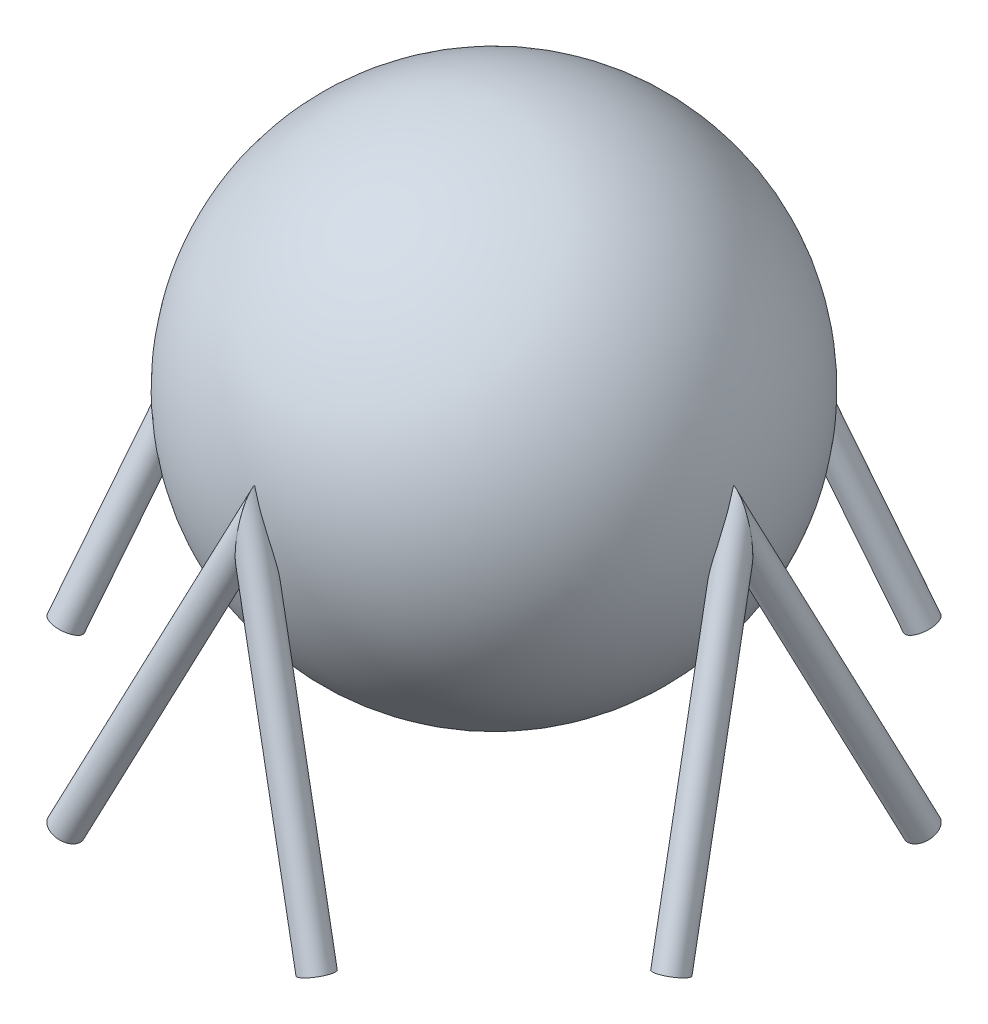
ISO-10303-21;
HEADER;
FILE_DESCRIPTION(('STEP AP214'),'2;1');
FILE_NAME('part.step','',(''),(''),'','','');
FILE_SCHEMA(('AUTOMOTIVE_DESIGN { 1 0 10303 214 1 1 1 1 }'));
ENDSEC;
DATA;
#1=APPLICATION_CONTEXT('core data for automotive mechanical design processes');
#2=APPLICATION_PROTOCOL_DEFINITION('international standard','automotive_design',2000,#1);
#3=PRODUCT_CONTEXT('',#1,'mechanical');
#4=PRODUCT('Part','Part','',(#3));
#5=PRODUCT_RELATED_PRODUCT_CATEGORY('part','',(#4));
#6=PRODUCT_DEFINITION_FORMATION('','',#4);
#7=PRODUCT_DEFINITION_CONTEXT('part definition',#1,'design');
#8=PRODUCT_DEFINITION('design','',#6,#7);
#9=PRODUCT_DEFINITION_SHAPE('','',#8);
#10=(LENGTH_UNIT() NAMED_UNIT(*) SI_UNIT(.MILLI.,.METRE.));
#11=(NAMED_UNIT(*) PLANE_ANGLE_UNIT() SI_UNIT($,.RADIAN.));
#12=(NAMED_UNIT(*) SI_UNIT($,.STERADIAN.) SOLID_ANGLE_UNIT());
#13=UNCERTAINTY_MEASURE_WITH_UNIT(LENGTH_MEASURE(1.E-05),#10,'distance_accuracy_value','');
#14=(GEOMETRIC_REPRESENTATION_CONTEXT(3) GLOBAL_UNCERTAINTY_ASSIGNED_CONTEXT((#13)) GLOBAL_UNIT_ASSIGNED_CONTEXT((#10,
#11,#12)) REPRESENTATION_CONTEXT('',''));
#15=CARTESIAN_POINT('',(0.,0.,0.));
#16=DIRECTION('',(0.,0.,1.));
#17=DIRECTION('',(1.,0.,0.));
#18=AXIS2_PLACEMENT_3D('',#15,#16,#17);
#19=CARTESIAN_POINT('',(274.31238,0.,-1.2490009027033E-13));
#20=DIRECTION('',(0.186456443584801,-0.902667771423086,0.387846476172967));
#21=DIRECTION('',(0.,-0.394769458097228,-0.918780210362426));
#22=AXIS2_PLACEMENT_3D('',#19,#20,#21);
#23=CYLINDRICAL_SURFACE('',#22,13.3223);
#24=CARTESIAN_POINT('',(342.519,-330.2,141.876015170467));
#25=DIRECTION('',(-0.186456443584801,0.902667771423086,-0.387846476172967));
#26=DIRECTION('',(0.,0.394769458097228,0.918780210362427));
#27=AXIS2_PLACEMENT_3D('',#24,#25,#26);
#28=CIRCLE('',#27,13.3223);
#29=CARTESIAN_POINT('',(342.519,-324.940762848391,154.116280766978));
#30=VERTEX_POINT('',#29);
#31=EDGE_CURVE('E61',#30,#30,#28,.T.);
#32=ORIENTED_EDGE('',*,*,#31,.F.);
#33=EDGE_LOOP('',(#32));
#34=FACE_BOUND('',#33,.T.);
#35=CARTESIAN_POINT('',(274.31238,0.,-1.2490009027033E-13));
#36=DIRECTION('',(0.,0.,-1.));
#37=DIRECTION('',(0.202290974214957,-0.979325462627805,0.));
#38=AXIS2_PLACEMENT_3D('',#35,#36,#37);
#39=ELLIPSE('',#38,34.3494161180897,13.3223);
#40=CARTESIAN_POINT('',(281.260956850243,-33.6392578308431,-1.38247519700187E-13));
#41=VERTEX_POINT('',#40);
#42=EDGE_CURVE('E57',#41,#41,#39,.T.);
#43=ORIENTED_EDGE('',*,*,#42,.T.);
#44=EDGE_LOOP('',(#43));
#45=FACE_BOUND('',#44,.T.);
#46=ADVANCED_FACE('F53',(#34,#45),#23,.F.);
#47=CARTESIAN_POINT('',(274.31238,0.,-1.2490009027033E-13));
#48=DIRECTION('',(0.186456443584801,-0.902667771423086,0.387846476172967));
#49=DIRECTION('',(0.,-0.394769458097228,-0.918780210362426));
#50=AXIS2_PLACEMENT_3D('',#47,#48,#49);
#51=CYLINDRICAL_SURFACE('',#50,16.7005);
#52=CARTESIAN_POINT('',(342.519,-330.2,141.876015170467));
#53=DIRECTION('',(-0.186456443584801,0.902667771423086,-0.387846476172967));
#54=DIRECTION('',(0.,0.394769458097228,0.918780210362427));
#55=AXIS2_PLACEMENT_3D('',#52,#53,#54);
#56=CIRCLE('',#55,16.7005);
#57=CARTESIAN_POINT('',(342.519,-323.607152665047,157.220104073625));
#58=VERTEX_POINT('',#57);
#59=EDGE_CURVE('E65',#58,#58,#56,.T.);
#60=ORIENTED_EDGE('',*,*,#59,.T.);
#61=EDGE_LOOP('',(#60));
#62=FACE_BOUND('',#61,.T.);
#63=CARTESIAN_POINT('',(274.31238,0.,-1.2490009027033E-13));
#64=DIRECTION('',(0.,0.,-1.));
#65=DIRECTION('',(0.202290974214957,-0.979325462627805,0.));
#66=AXIS2_PLACEMENT_3D('',#63,#64,#65);
#67=ELLIPSE('',#66,43.0595635798741,16.7005);
#68=CARTESIAN_POINT('',(283.022941065844,-42.1693270234116,-1.41632091891171E-13));
#69=VERTEX_POINT('',#68);
#70=EDGE_CURVE('E12',#69,#69,#67,.T.);
#71=ORIENTED_EDGE('',*,*,#70,.F.);
#72=EDGE_LOOP('',(#71));
#73=FACE_BOUND('',#72,.T.);
#74=ADVANCED_FACE('F80',(#62,#73),#51,.T.);
#75=CARTESIAN_POINT('',(342.519,-330.2,141.876015170467));
#76=DIRECTION('',(-0.186456443584801,0.902667771423086,-0.387846476172967));
#77=DIRECTION('',(0.,0.394769458097228,0.918780210362427));
#78=AXIS2_PLACEMENT_3D('',#75,#76,#77);
#79=PLANE('',#78);
#80=ORIENTED_EDGE('',*,*,#31,.T.);
#81=EDGE_LOOP('',(#80));
#82=FACE_BOUND('',#81,.T.);
#83=ORIENTED_EDGE('',*,*,#59,.F.);
#84=EDGE_LOOP('',(#83));
#85=FACE_BOUND('',#84,.T.);
#86=ADVANCED_FACE('F76',(#82,#85),#79,.F.);
#87=CARTESIAN_POINT('',(274.31238,0.,-1.2490009027033E-13));
#88=DIRECTION('',(0.,0.,-1.));
#89=DIRECTION('',(-0.999999999999999,0.,0.));
#90=AXIS2_PLACEMENT_3D('',#87,#88,#89);
#91=PLANE('',#90);
#92=ORIENTED_EDGE('',*,*,#42,.F.);
#93=EDGE_LOOP('',(#92));
#94=FACE_BOUND('',#93,.T.);
#95=ORIENTED_EDGE('',*,*,#70,.T.);
#96=EDGE_LOOP('',(#95));
#97=FACE_BOUND('',#96,.T.);
#98=ADVANCED_FACE('F55',(#94,#97),#91,.T.);
#99=CLOSED_SHELL('',(#46,#74,#86,#98));
#100=MANIFOLD_SOLID_BREP('B2_NOT_SHOWN',#99);
#101=CARTESIAN_POINT('',(342.519,-330.2,-141.876015170467));
#102=DIRECTION('',(-0.186456443584801,0.902667771423086,0.387846476172966));
#103=DIRECTION('',(0.,-0.394769458097227,0.918780210362425));
#104=AXIS2_PLACEMENT_3D('',#101,#102,#103);
#105=CYLINDRICAL_SURFACE('',#104,13.3223);
#106=CARTESIAN_POINT('',(342.519,-330.2,-141.876015170467));
#107=DIRECTION('',(0.186456443584801,-0.902667771423086,-0.387846476172967));
#108=DIRECTION('',(0.,0.394769458097227,-0.918780210362425));
#109=AXIS2_PLACEMENT_3D('',#106,#107,#108);
#110=CIRCLE('',#109,13.3223);
#111=CARTESIAN_POINT('',(342.519,-324.940762848391,-154.116280766979));
#112=VERTEX_POINT('',#111);
#113=EDGE_CURVE('E162',#112,#112,#110,.T.);
#114=ORIENTED_EDGE('',*,*,#113,.T.);
#115=EDGE_LOOP('',(#114));
#116=FACE_BOUND('',#115,.T.);
#117=CARTESIAN_POINT('',(274.31238,0.,-1.11022302462516E-13));
#118=DIRECTION('',(0.,0.,1.));
#119=DIRECTION('',(-0.202290974214957,0.979325462627805,0.));
#120=AXIS2_PLACEMENT_3D('',#117,#118,#119);
#121=ELLIPSE('',#120,34.3494161180897,13.3223);
#122=CARTESIAN_POINT('',(267.363803149757,33.6392578308431,-1.14835853728189E-13));
#123=VERTEX_POINT('',#122);
#124=EDGE_CURVE('E152',#123,#123,#121,.T.);
#125=ORIENTED_EDGE('',*,*,#124,.T.);
#126=EDGE_LOOP('',(#125));
#127=FACE_BOUND('',#126,.T.);
#128=ADVANCED_FACE('F148',(#116,#127),#105,.F.);
#129=CARTESIAN_POINT('',(342.519,-330.2,-141.876015170467));
#130=DIRECTION('',(-0.186456443584801,0.902667771423086,0.387846476172966));
#131=DIRECTION('',(0.,-0.394769458097227,0.918780210362425));
#132=AXIS2_PLACEMENT_3D('',#129,#130,#131);
#133=CYLINDRICAL_SURFACE('',#132,16.7005);
#134=CARTESIAN_POINT('',(342.519,-330.2,-141.876015170467));
#135=DIRECTION('',(0.186456443584801,-0.902667771423086,-0.387846476172967));
#136=DIRECTION('',(0.,0.394769458097227,-0.918780210362425));
#137=AXIS2_PLACEMENT_3D('',#134,#135,#136);
#138=CIRCLE('',#137,16.7005);
#139=CARTESIAN_POINT('',(342.519,-323.607152665047,-157.220104073625));
#140=VERTEX_POINT('',#139);
#141=EDGE_CURVE('E156',#140,#140,#138,.T.);
#142=ORIENTED_EDGE('',*,*,#141,.F.);
#143=EDGE_LOOP('',(#142));
#144=FACE_BOUND('',#143,.T.);
#145=CARTESIAN_POINT('',(274.31238,0.,-1.11022302462516E-13));
#146=DIRECTION('',(0.,0.,1.));
#147=DIRECTION('',(-0.202290974214957,0.979325462627805,0.));
#148=AXIS2_PLACEMENT_3D('',#145,#146,#147);
#149=ELLIPSE('',#148,43.0595635798742,16.7005);
#150=CARTESIAN_POINT('',(265.601818934157,42.1693270234116,-1.15802874354184E-13));
#151=VERTEX_POINT('',#150);
#152=EDGE_CURVE('E52',#151,#151,#149,.T.);
#153=ORIENTED_EDGE('',*,*,#152,.F.);
#154=EDGE_LOOP('',(#153));
#155=FACE_BOUND('',#154,.T.);
#156=ADVANCED_FACE('F175',(#144,#155),#133,.T.);
#157=CARTESIAN_POINT('',(342.519,-330.2,-141.876015170467));
#158=DIRECTION('',(0.186456443584801,-0.902667771423086,-0.387846476172967));
#159=DIRECTION('',(0.,0.394769458097227,-0.918780210362425));
#160=AXIS2_PLACEMENT_3D('',#157,#158,#159);
#161=PLANE('',#160);
#162=ORIENTED_EDGE('',*,*,#113,.F.);
#163=EDGE_LOOP('',(#162));
#164=FACE_BOUND('',#163,.T.);
#165=ORIENTED_EDGE('',*,*,#141,.T.);
#166=EDGE_LOOP('',(#165));
#167=FACE_BOUND('',#166,.T.);
#168=ADVANCED_FACE('F171',(#164,#167),#161,.T.);
#169=CARTESIAN_POINT('',(274.31238,0.,-1.2490009027033E-13));
#170=DIRECTION('',(0.,0.,1.));
#171=DIRECTION('',(1.,0.,0.));
#172=AXIS2_PLACEMENT_3D('',#169,#170,#171);
#173=PLANE('',#172);
#174=ORIENTED_EDGE('',*,*,#124,.F.);
#175=EDGE_LOOP('',(#174));
#176=FACE_BOUND('',#175,.T.);
#177=ORIENTED_EDGE('',*,*,#152,.T.);
#178=EDGE_LOOP('',(#177));
#179=FACE_BOUND('',#178,.T.);
#180=ADVANCED_FACE('F150',(#176,#179),#173,.T.);
#181=CLOSED_SHELL('',(#128,#156,#168,#180));
#182=MANIFOLD_SOLID_BREP('B7_NOT_SHOWN',#181);
#183=CARTESIAN_POINT('',(-1.06858966120171E-12,1.11022302462516E-13,274.31238));
#184=DIRECTION('',(-0.387846476172967,-0.902667771423086,0.1864564435848));
#185=DIRECTION('',(0.918780210362425,-0.394769458097228,0.));
#186=AXIS2_PLACEMENT_3D('',#183,#184,#185);
#187=CYLINDRICAL_SURFACE('',#186,13.3223);
#188=CARTESIAN_POINT('',(-141.876015170468,-330.2,342.519));
#189=DIRECTION('',(0.387846476172967,0.902667771423086,-0.1864564435848));
#190=DIRECTION('',(0.0389159408015235,-0.218147238009058,-0.975139647486734));
#191=AXIS2_PLACEMENT_3D('',#188,#189,#190);
#192=CIRCLE('',#191,13.3223);
#193=CARTESIAN_POINT('',(-141.357565332328,-333.106222948928,329.527897074287));
#194=VERTEX_POINT('',#193);
#195=EDGE_CURVE('E251',#194,#194,#192,.T.);
#196=ORIENTED_EDGE('',*,*,#195,.F.);
#197=EDGE_LOOP('',(#196));
#198=FACE_BOUND('',#197,.T.);
#199=CARTESIAN_POINT('',(-1.08246744900953E-12,0.,274.31238));
#200=DIRECTION('',(1.,0.,0.));
#201=DIRECTION('',(0.,-0.979325462627805,0.202290974214957));
#202=AXIS2_PLACEMENT_3D('',#199,#200,#201);
#203=ELLIPSE('',#202,34.3494161180897,13.3223);
#204=CARTESIAN_POINT('',(-1.09581487843938E-12,-33.6392578308431,281.260956850243));
#205=VERTEX_POINT('',#204);
#206=EDGE_CURVE('E247',#205,#205,#203,.T.);
#207=ORIENTED_EDGE('',*,*,#206,.T.);
#208=EDGE_LOOP('',(#207));
#209=FACE_BOUND('',#208,.T.);
#210=ADVANCED_FACE('F243',(#198,#209),#187,.F.);
#211=CARTESIAN_POINT('',(-1.06858966120171E-12,1.11022302462516E-13,274.31238));
#212=DIRECTION('',(-0.387846476172967,-0.902667771423086,0.1864564435848));
#213=DIRECTION('',(0.918780210362425,-0.394769458097228,0.));
#214=AXIS2_PLACEMENT_3D('',#211,#212,#213);
#215=CYLINDRICAL_SURFACE('',#214,16.7005);
#216=CARTESIAN_POINT('',(-141.876015170468,-330.2,342.519));
#217=DIRECTION('',(0.387846476172967,0.902667771423086,-0.1864564435848));
#218=DIRECTION('',(0.0389159408015235,-0.218147238009058,-0.975139647486734));
#219=AXIS2_PLACEMENT_3D('',#216,#217,#218);
#220=CIRCLE('',#219,16.7005);
#221=CARTESIAN_POINT('',(-141.226099501113,-333.84316794837,326.233680317148));
#222=VERTEX_POINT('',#221);
#223=EDGE_CURVE('E255',#222,#222,#220,.T.);
#224=ORIENTED_EDGE('',*,*,#223,.T.);
#225=EDGE_LOOP('',(#224));
#226=FACE_BOUND('',#225,.T.);
#227=CARTESIAN_POINT('',(-1.08246744900953E-12,0.,274.31238));
#228=DIRECTION('',(1.,0.,0.));
#229=DIRECTION('',(0.,-0.979325462627805,0.202290974214957));
#230=AXIS2_PLACEMENT_3D('',#227,#228,#229);
#231=ELLIPSE('',#230,43.0595635798742,16.7005);
#232=CARTESIAN_POINT('',(-1.09919945063037E-12,-42.1693270234116,283.022941065844));
#233=VERTEX_POINT('',#232);
#234=EDGE_CURVE('E147',#233,#233,#231,.T.);
#235=ORIENTED_EDGE('',*,*,#234,.F.);
#236=EDGE_LOOP('',(#235));
#237=FACE_BOUND('',#236,.T.);
#238=ADVANCED_FACE('F270',(#226,#237),#215,.T.);
#239=CARTESIAN_POINT('',(-141.876015170468,-330.2,342.519));
#240=DIRECTION('',(0.387846476172967,0.902667771423086,-0.1864564435848));
#241=DIRECTION('',(0.0389159408015235,-0.218147238009058,-0.975139647486734));
#242=AXIS2_PLACEMENT_3D('',#239,#240,#241);
#243=PLANE('',#242);
#244=ORIENTED_EDGE('',*,*,#195,.T.);
#245=EDGE_LOOP('',(#244));
#246=FACE_BOUND('',#245,.T.);
#247=ORIENTED_EDGE('',*,*,#223,.F.);
#248=EDGE_LOOP('',(#247));
#249=FACE_BOUND('',#248,.T.);
#250=ADVANCED_FACE('F266',(#246,#249),#243,.F.);
#251=CARTESIAN_POINT('',(-1.08246744900953E-12,0.,274.31238));
#252=DIRECTION('',(1.,0.,0.));
#253=DIRECTION('',(0.,0.,-1.));
#254=AXIS2_PLACEMENT_3D('',#251,#252,#253);
#255=PLANE('',#254);
#256=ORIENTED_EDGE('',*,*,#206,.F.);
#257=EDGE_LOOP('',(#256));
#258=FACE_BOUND('',#257,.T.);
#259=ORIENTED_EDGE('',*,*,#234,.T.);
#260=EDGE_LOOP('',(#259));
#261=FACE_BOUND('',#260,.T.);
#262=ADVANCED_FACE('F245',(#258,#261),#255,.T.);
#263=CLOSED_SHELL('',(#210,#238,#250,#262));
#264=MANIFOLD_SOLID_BREP('B47_NOT_SHOWN',#263);
#265=CARTESIAN_POINT('',(141.876015170466,-330.2,342.519000000001));
#266=DIRECTION('',(-0.387846476172966,0.902667771423086,-0.186456443584802));
#267=DIRECTION('',(-0.918780210362425,-0.394769458097227,0.));
#268=AXIS2_PLACEMENT_3D('',#265,#266,#267);
#269=CYLINDRICAL_SURFACE('',#268,13.3223);
#270=CARTESIAN_POINT('',(141.876015170466,-330.2,342.519000000001));
#271=DIRECTION('',(0.387846476172967,-0.902667771423086,0.186456443584802));
#272=DIRECTION('',(-0.0389159408015174,-0.218147238009058,-0.975139647486734));
#273=AXIS2_PLACEMENT_3D('',#270,#271,#272);
#274=CIRCLE('',#273,13.3223);
#275=CARTESIAN_POINT('',(141.357565332326,-333.106222948928,329.527897074288));
#276=VERTEX_POINT('',#275);
#277=EDGE_CURVE('E352',#276,#276,#274,.T.);
#278=ORIENTED_EDGE('',*,*,#277,.T.);
#279=EDGE_LOOP('',(#278));
#280=FACE_BOUND('',#279,.T.);
#281=CARTESIAN_POINT('',(-1.13797860024079E-12,1.94289029309402E-13,274.31238));
#282=DIRECTION('',(-1.,0.,0.));
#283=DIRECTION('',(0.,0.979325462627805,-0.202290974214957));
#284=AXIS2_PLACEMENT_3D('',#281,#282,#283);
#285=ELLIPSE('',#284,34.3494161180897,13.3223);
#286=CARTESIAN_POINT('',(-1.12081761954526E-12,33.6392578308433,267.363803149757));
#287=VERTEX_POINT('',#286);
#288=EDGE_CURVE('E342',#287,#287,#285,.T.);
#289=ORIENTED_EDGE('',*,*,#288,.T.);
#290=EDGE_LOOP('',(#289));
#291=FACE_BOUND('',#290,.T.);
#292=ADVANCED_FACE('F338',(#280,#291),#269,.F.);
#293=CARTESIAN_POINT('',(141.876015170466,-330.2,342.519000000001));
#294=DIRECTION('',(-0.387846476172966,0.902667771423086,-0.186456443584802));
#295=DIRECTION('',(-0.918780210362425,-0.394769458097227,0.));
#296=AXIS2_PLACEMENT_3D('',#293,#294,#295);
#297=CYLINDRICAL_SURFACE('',#296,16.7005);
#298=CARTESIAN_POINT('',(141.876015170466,-330.2,342.519000000001));
#299=DIRECTION('',(0.387846476172967,-0.902667771423086,0.186456443584802));
#300=DIRECTION('',(-0.0389159408015174,-0.218147238009058,-0.975139647486734));
#301=AXIS2_PLACEMENT_3D('',#298,#299,#300);
#302=CIRCLE('',#301,16.7005);
#303=CARTESIAN_POINT('',(141.22609950111,-333.84316794837,326.233680317148));
#304=VERTEX_POINT('',#303);
#305=EDGE_CURVE('E346',#304,#304,#302,.T.);
#306=ORIENTED_EDGE('',*,*,#305,.F.);
#307=EDGE_LOOP('',(#306));
#308=FACE_BOUND('',#307,.T.);
#309=CARTESIAN_POINT('',(-1.13797860024079E-12,1.94289029309402E-13,274.31238));
#310=DIRECTION('',(-1.,0.,0.));
#311=DIRECTION('',(0.,0.979325462627805,-0.202290974214957));
#312=AXIS2_PLACEMENT_3D('',#309,#310,#311);
#313=ELLIPSE('',#312,43.0595635798742,16.7005);
#314=CARTESIAN_POINT('',(-1.11646602672828E-12,42.1693270234118,265.601818934157));
#315=VERTEX_POINT('',#314);
#316=EDGE_CURVE('E242',#315,#315,#313,.T.);
#317=ORIENTED_EDGE('',*,*,#316,.F.);
#318=EDGE_LOOP('',(#317));
#319=FACE_BOUND('',#318,.T.);
#320=ADVANCED_FACE('F365',(#308,#319),#297,.T.);
#321=CARTESIAN_POINT('',(141.876015170466,-330.2,342.519000000001));
#322=DIRECTION('',(0.387846476172967,-0.902667771423086,0.186456443584802));
#323=DIRECTION('',(-0.0389159408015174,-0.218147238009058,-0.975139647486734));
#324=AXIS2_PLACEMENT_3D('',#321,#322,#323);
#325=PLANE('',#324);
#326=ORIENTED_EDGE('',*,*,#277,.F.);
#327=EDGE_LOOP('',(#326));
#328=FACE_BOUND('',#327,.T.);
#329=ORIENTED_EDGE('',*,*,#305,.T.);
#330=EDGE_LOOP('',(#329));
#331=FACE_BOUND('',#330,.T.);
#332=ADVANCED_FACE('F361',(#328,#331),#325,.T.);
#333=CARTESIAN_POINT('',(-1.1518563880486E-12,0.,274.31238));
#334=DIRECTION('',(-1.,0.,0.));
#335=DIRECTION('',(0.,0.,1.));
#336=AXIS2_PLACEMENT_3D('',#333,#334,#335);
#337=PLANE('',#336);
#338=ORIENTED_EDGE('',*,*,#288,.F.);
#339=EDGE_LOOP('',(#338));
#340=FACE_BOUND('',#339,.T.);
#341=ORIENTED_EDGE('',*,*,#316,.T.);
#342=EDGE_LOOP('',(#341));
#343=FACE_BOUND('',#342,.T.);
#344=ADVANCED_FACE('F340',(#340,#343),#337,.T.);
#345=CLOSED_SHELL('',(#292,#320,#332,#344));
#346=MANIFOLD_SOLID_BREP('B142_NOT_SHOWN',#345);
#347=CARTESIAN_POINT('',(-274.31238,0.,0.));
#348=DIRECTION('',(-0.186456443584801,-0.902667771423086,-0.387846476172966));
#349=DIRECTION('',(0.,0.394769458097227,-0.918780210362425));
#350=AXIS2_PLACEMENT_3D('',#347,#348,#349);
#351=CYLINDRICAL_SURFACE('',#350,13.3223);
#352=CARTESIAN_POINT('',(-342.519,-330.2,-141.876015170467));
#353=DIRECTION('',(0.186456443584801,0.902667771423086,0.387846476172966));
#354=DIRECTION('',(0.389269029598969,-0.43033722239693,0.814419730614854));
#355=AXIS2_PLACEMENT_3D('',#352,#353,#354);
#356=CIRCLE('',#355,13.3223);
#357=CARTESIAN_POINT('',(-337.333041206974,-335.933081577939,-131.026071193297));
#358=VERTEX_POINT('',#357);
#359=EDGE_CURVE('E441',#358,#358,#356,.T.);
#360=ORIENTED_EDGE('',*,*,#359,.F.);
#361=EDGE_LOOP('',(#360));
#362=FACE_BOUND('',#361,.T.);
#363=CARTESIAN_POINT('',(-274.31238,0.,0.));
#364=DIRECTION('',(0.,0.,1.));
#365=DIRECTION('',(-0.202290974214957,-0.979325462627805,0.));
#366=AXIS2_PLACEMENT_3D('',#363,#364,#365);
#367=ELLIPSE('',#366,34.3494161180897,13.3223);
#368=CARTESIAN_POINT('',(-281.260956850243,-33.6392578308432,0.));
#369=VERTEX_POINT('',#368);
#370=EDGE_CURVE('E437',#369,#369,#367,.T.);
#371=ORIENTED_EDGE('',*,*,#370,.T.);
#372=EDGE_LOOP('',(#371));
#373=FACE_BOUND('',#372,.T.);
#374=ADVANCED_FACE('F433',(#362,#373),#351,.F.);
#375=CARTESIAN_POINT('',(-274.31238,0.,0.));
#376=DIRECTION('',(-0.186456443584801,-0.902667771423086,-0.387846476172966));
#377=DIRECTION('',(0.,0.394769458097227,-0.918780210362425));
#378=AXIS2_PLACEMENT_3D('',#375,#376,#377);
#379=CYLINDRICAL_SURFACE('',#378,16.7005);
#380=CARTESIAN_POINT('',(-342.519,-330.2,-141.876015170467));
#381=DIRECTION('',(0.186456443584801,0.902667771423086,0.387846476172966));
#382=DIRECTION('',(0.389269029598969,-0.43033722239693,0.814419730614854));
#383=AXIS2_PLACEMENT_3D('',#380,#381,#382);
#384=CIRCLE('',#383,16.7005);
#385=CARTESIAN_POINT('',(-336.018012571183,-337.38684678264,-128.274798459334));
#386=VERTEX_POINT('',#385);
#387=EDGE_CURVE('E445',#386,#386,#384,.T.);
#388=ORIENTED_EDGE('',*,*,#387,.T.);
#389=EDGE_LOOP('',(#388));
#390=FACE_BOUND('',#389,.T.);
#391=CARTESIAN_POINT('',(-274.31238,0.,0.));
#392=DIRECTION('',(0.,0.,1.));
#393=DIRECTION('',(-0.202290974214957,-0.979325462627805,0.));
#394=AXIS2_PLACEMENT_3D('',#391,#392,#393);
#395=ELLIPSE('',#394,43.0595635798742,16.7005);
#396=CARTESIAN_POINT('',(-283.022941065844,-42.1693270234117,0.));
#397=VERTEX_POINT('',#396);
#398=EDGE_CURVE('E337',#397,#397,#395,.T.);
#399=ORIENTED_EDGE('',*,*,#398,.F.);
#400=EDGE_LOOP('',(#399));
#401=FACE_BOUND('',#400,.T.);
#402=ADVANCED_FACE('F460',(#390,#401),#379,.T.);
#403=CARTESIAN_POINT('',(-342.519,-330.2,-141.876015170467));
#404=DIRECTION('',(0.186456443584801,0.902667771423086,0.387846476172966));
#405=DIRECTION('',(0.389269029598969,-0.43033722239693,0.814419730614854));
#406=AXIS2_PLACEMENT_3D('',#403,#404,#405);
#407=PLANE('',#406);
#408=ORIENTED_EDGE('',*,*,#359,.T.);
#409=EDGE_LOOP('',(#408));
#410=FACE_BOUND('',#409,.T.);
#411=ORIENTED_EDGE('',*,*,#387,.F.);
#412=EDGE_LOOP('',(#411));
#413=FACE_BOUND('',#412,.T.);
#414=ADVANCED_FACE('F456',(#410,#413),#407,.F.);
#415=CARTESIAN_POINT('',(-274.31238,0.,-1.11022302462516E-13));
#416=DIRECTION('',(0.,0.,1.));
#417=DIRECTION('',(0.,-1.,0.));
#418=AXIS2_PLACEMENT_3D('',#415,#416,#417);
#419=PLANE('',#418);
#420=ORIENTED_EDGE('',*,*,#370,.F.);
#421=EDGE_LOOP('',(#420));
#422=FACE_BOUND('',#421,.T.);
#423=ORIENTED_EDGE('',*,*,#398,.T.);
#424=EDGE_LOOP('',(#423));
#425=FACE_BOUND('',#424,.T.);
#426=ADVANCED_FACE('F435',(#422,#425),#419,.T.);
#427=CLOSED_SHELL('',(#374,#402,#414,#426));
#428=MANIFOLD_SOLID_BREP('B237_NOT_SHOWN',#427);
#429=CARTESIAN_POINT('',(-342.519,-330.2,141.876015170467));
#430=DIRECTION('',(0.186456443584801,0.902667771423086,-0.387846476172967));
#431=DIRECTION('',(0.,0.394769458097228,0.918780210362425));
#432=AXIS2_PLACEMENT_3D('',#429,#430,#431);
#433=CYLINDRICAL_SURFACE('',#432,13.3223);
#434=CARTESIAN_POINT('',(-342.519,-330.2,141.876015170467));
#435=DIRECTION('',(-0.186456443584801,-0.902667771423087,0.387846476172967));
#436=DIRECTION('',(0.389269029598969,-0.430337222396931,-0.814419730614854));
#437=AXIS2_PLACEMENT_3D('',#434,#435,#436);
#438=CIRCLE('',#437,13.3223);
#439=CARTESIAN_POINT('',(-337.333041206974,-335.933081577939,131.026071193297));
#440=VERTEX_POINT('',#439);
#441=EDGE_CURVE('E542',#440,#440,#438,.T.);
#442=ORIENTED_EDGE('',*,*,#441,.T.);
#443=EDGE_LOOP('',(#442));
#444=FACE_BOUND('',#443,.T.);
#445=CARTESIAN_POINT('',(-274.31238,0.,-1.38777878078145E-13));
#446=DIRECTION('',(0.,0.,-1.));
#447=DIRECTION('',(0.202290974214957,0.979325462627805,0.));
#448=AXIS2_PLACEMENT_3D('',#445,#446,#447);
#449=ELLIPSE('',#448,34.3494161180897,13.3223);
#450=CARTESIAN_POINT('',(-267.363803149757,33.6392578308432,-1.48311756242328E-13));
#451=VERTEX_POINT('',#450);
#452=EDGE_CURVE('E532',#451,#451,#449,.T.);
#453=ORIENTED_EDGE('',*,*,#452,.T.);
#454=EDGE_LOOP('',(#453));
#455=FACE_BOUND('',#454,.T.);
#456=ADVANCED_FACE('F528',(#444,#455),#433,.F.);
#457=CARTESIAN_POINT('',(-342.519,-330.2,141.876015170467));
#458=DIRECTION('',(0.186456443584801,0.902667771423086,-0.387846476172967));
#459=DIRECTION('',(0.,0.394769458097228,0.918780210362425));
#460=AXIS2_PLACEMENT_3D('',#457,#458,#459);
#461=CYLINDRICAL_SURFACE('',#460,16.7005);
#462=CARTESIAN_POINT('',(-342.519,-330.2,141.876015170467));
#463=DIRECTION('',(-0.186456443584801,-0.902667771423087,0.387846476172967));
#464=DIRECTION('',(0.389269029598969,-0.430337222396931,-0.814419730614854));
#465=AXIS2_PLACEMENT_3D('',#462,#463,#464);
#466=CIRCLE('',#465,16.7005);
#467=CARTESIAN_POINT('',(-336.018012571182,-337.38684678264,128.274798459334));
#468=VERTEX_POINT('',#467);
#469=EDGE_CURVE('E536',#468,#468,#466,.T.);
#470=ORIENTED_EDGE('',*,*,#469,.F.);
#471=EDGE_LOOP('',(#470));
#472=FACE_BOUND('',#471,.T.);
#473=CARTESIAN_POINT('',(-274.31238,0.,-1.38777878078145E-13));
#474=DIRECTION('',(0.,0.,-1.));
#475=DIRECTION('',(0.202290974214957,0.979325462627805,0.));
#476=AXIS2_PLACEMENT_3D('',#473,#474,#475);
#477=ELLIPSE('',#476,43.0595635798742,16.7005);
#478=CARTESIAN_POINT('',(-265.601818934157,42.1693270234117,-1.50729307807316E-13));
#479=VERTEX_POINT('',#478);
#480=EDGE_CURVE('E432',#479,#479,#477,.T.);
#481=ORIENTED_EDGE('',*,*,#480,.F.);
#482=EDGE_LOOP('',(#481));
#483=FACE_BOUND('',#482,.T.);
#484=ADVANCED_FACE('F555',(#472,#483),#461,.T.);
#485=CARTESIAN_POINT('',(-342.519,-330.2,141.876015170467));
#486=DIRECTION('',(-0.186456443584801,-0.902667771423087,0.387846476172967));
#487=DIRECTION('',(0.389269029598969,-0.430337222396931,-0.814419730614854));
#488=AXIS2_PLACEMENT_3D('',#485,#486,#487);
#489=PLANE('',#488);
#490=ORIENTED_EDGE('',*,*,#441,.F.);
#491=EDGE_LOOP('',(#490));
#492=FACE_BOUND('',#491,.T.);
#493=ORIENTED_EDGE('',*,*,#469,.T.);
#494=EDGE_LOOP('',(#493));
#495=FACE_BOUND('',#494,.T.);
#496=ADVANCED_FACE('F551',(#492,#495),#489,.T.);
#497=CARTESIAN_POINT('',(-274.31238,0.,-1.52655665885959E-13));
#498=DIRECTION('',(0.,0.,-1.));
#499=DIRECTION('',(0.,1.,0.));
#500=AXIS2_PLACEMENT_3D('',#497,#498,#499);
#501=PLANE('',#500);
#502=ORIENTED_EDGE('',*,*,#452,.F.);
#503=EDGE_LOOP('',(#502));
#504=FACE_BOUND('',#503,.T.);
#505=ORIENTED_EDGE('',*,*,#480,.T.);
#506=EDGE_LOOP('',(#505));
#507=FACE_BOUND('',#506,.T.);
#508=ADVANCED_FACE('F530',(#504,#507),#501,.T.);
#509=CLOSED_SHELL('',(#456,#484,#496,#508));
#510=MANIFOLD_SOLID_BREP('B332_NOT_SHOWN',#509);
#511=CARTESIAN_POINT('',(-1.02695629777827E-12,0.,-274.31238));
#512=DIRECTION('',(0.387846476172966,-0.902667771423086,-0.186456443584802));
#513=DIRECTION('',(0.918780210362425,0.394769458097227,0.));
#514=AXIS2_PLACEMENT_3D('',#511,#512,#513);
#515=CYLINDRICAL_SURFACE('',#514,13.3223);
#516=CARTESIAN_POINT('',(141.876015170466,-330.2,-342.519000000001));
#517=DIRECTION('',(-0.387846476172967,0.902667771423086,0.186456443584802));
#518=DIRECTION('',(-0.641247708285323,-0.118936823784124,-0.758060293490541));
#519=AXIS2_PLACEMENT_3D('',#516,#517,#518);
#520=CIRCLE('',#519,13.3223);
#521=CARTESIAN_POINT('',(133.333120826377,-331.784512047499,-352.61810664797));
#522=VERTEX_POINT('',#521);
#523=EDGE_CURVE('E631',#522,#522,#520,.T.);
#524=ORIENTED_EDGE('',*,*,#523,.F.);
#525=EDGE_LOOP('',(#524));
#526=FACE_BOUND('',#525,.T.);
#527=CARTESIAN_POINT('',(-1.12410081243297E-12,1.94289029309402E-13,-274.31238));
#528=DIRECTION('',(-1.,0.,0.));
#529=DIRECTION('',(0.,-0.979325462627805,-0.202290974214957));
#530=AXIS2_PLACEMENT_3D('',#527,#528,#529);
#531=ELLIPSE('',#530,34.3494161180897,13.3223);
#532=CARTESIAN_POINT('',(-1.13363469059715E-12,-33.639257830843,-281.260956850244));
#533=VERTEX_POINT('',#532);
#534=EDGE_CURVE('E627',#533,#533,#531,.T.);
#535=ORIENTED_EDGE('',*,*,#534,.T.);
#536=EDGE_LOOP('',(#535));
#537=FACE_BOUND('',#536,.T.);
#538=ADVANCED_FACE('F623',(#526,#537),#515,.F.);
#539=CARTESIAN_POINT('',(-1.02695629777827E-12,0.,-274.31238));
#540=DIRECTION('',(0.387846476172966,-0.902667771423086,-0.186456443584802));
#541=DIRECTION('',(0.918780210362425,0.394769458097227,0.));
#542=AXIS2_PLACEMENT_3D('',#539,#540,#541);
#543=CYLINDRICAL_SURFACE('',#542,16.7005);
#544=CARTESIAN_POINT('',(141.876015170466,-330.2,-342.519000000001));
#545=DIRECTION('',(-0.387846476172967,0.902667771423086,0.186456443584802));
#546=DIRECTION('',(-0.641247708285323,-0.118936823784124,-0.758060293490541));
#547=AXIS2_PLACEMENT_3D('',#544,#545,#546);
#548=CIRCLE('',#547,16.7005);
#549=CARTESIAN_POINT('',(131.166857818247,-332.186304425607,-355.17898593144));
#550=VERTEX_POINT('',#549);
#551=EDGE_CURVE('E635',#550,#550,#548,.T.);
#552=ORIENTED_EDGE('',*,*,#551,.T.);
#553=EDGE_LOOP('',(#552));
#554=FACE_BOUND('',#553,.T.);
#555=CARTESIAN_POINT('',(-1.12410081243297E-12,1.94289029309402E-13,-274.31238));
#556=DIRECTION('',(-1.,0.,0.));
#557=DIRECTION('',(0.,-0.979325462627805,-0.202290974214957));
#558=AXIS2_PLACEMENT_3D('',#555,#556,#557);
#559=ELLIPSE('',#558,43.0595635798742,16.7005);
#560=CARTESIAN_POINT('',(-1.13605224216214E-12,-42.1693270234115,-283.022941065844));
#561=VERTEX_POINT('',#560);
#562=EDGE_CURVE('E527',#561,#561,#559,.T.);
#563=ORIENTED_EDGE('',*,*,#562,.F.);
#564=EDGE_LOOP('',(#563));
#565=FACE_BOUND('',#564,.T.);
#566=ADVANCED_FACE('F650',(#554,#565),#543,.T.);
#567=CARTESIAN_POINT('',(141.876015170466,-330.2,-342.519000000001));
#568=DIRECTION('',(-0.387846476172967,0.902667771423086,0.186456443584802));
#569=DIRECTION('',(-0.641247708285323,-0.118936823784124,-0.758060293490541));
#570=AXIS2_PLACEMENT_3D('',#567,#568,#569);
#571=PLANE('',#570);
#572=ORIENTED_EDGE('',*,*,#523,.T.);
#573=EDGE_LOOP('',(#572));
#574=FACE_BOUND('',#573,.T.);
#575=ORIENTED_EDGE('',*,*,#551,.F.);
#576=EDGE_LOOP('',(#575));
#577=FACE_BOUND('',#576,.T.);
#578=ADVANCED_FACE('F646',(#574,#577),#571,.F.);
#579=CARTESIAN_POINT('',(-1.12410081243297E-12,0.,-274.31238));
#580=DIRECTION('',(-1.,0.,0.));
#581=DIRECTION('',(0.,0.,1.));
#582=AXIS2_PLACEMENT_3D('',#579,#580,#581);
#583=PLANE('',#582);
#584=ORIENTED_EDGE('',*,*,#534,.F.);
#585=EDGE_LOOP('',(#584));
#586=FACE_BOUND('',#585,.T.);
#587=ORIENTED_EDGE('',*,*,#562,.T.);
#588=EDGE_LOOP('',(#587));
#589=FACE_BOUND('',#588,.T.);
#590=ADVANCED_FACE('F625',(#586,#589),#583,.T.);
#591=CLOSED_SHELL('',(#538,#566,#578,#590));
#592=MANIFOLD_SOLID_BREP('B427_NOT_SHOWN',#591);
#593=CARTESIAN_POINT('',(-141.876015170468,-330.2,-342.519));
#594=DIRECTION('',(0.387846476172967,0.902667771423086,0.1864564435848));
#595=DIRECTION('',(-0.918780210362425,0.394769458097228,0.));
#596=AXIS2_PLACEMENT_3D('',#593,#594,#595);
#597=CYLINDRICAL_SURFACE('',#596,13.3223);
#598=CARTESIAN_POINT('',(-141.876015170468,-330.2,-342.519));
#599=DIRECTION('',(-0.387846476172967,-0.902667771423086,-0.1864564435848));
#600=DIRECTION('',(0.641247708285319,-0.118936823784124,-0.758060293490545));
#601=AXIS2_PLACEMENT_3D('',#598,#599,#600);
#602=CIRCLE('',#601,13.3223);
#603=CARTESIAN_POINT('',(-133.333120826379,-331.784512047499,-352.618106647969));
#604=VERTEX_POINT('',#603);
#605=EDGE_CURVE('E729',#604,#604,#602,.T.);
#606=ORIENTED_EDGE('',*,*,#605,.T.);
#607=EDGE_LOOP('',(#606));
#608=FACE_BOUND('',#607,.T.);
#609=CARTESIAN_POINT('',(-1.13797860024079E-12,0.,-274.31238));
#610=DIRECTION('',(1.,0.,0.));
#611=DIRECTION('',(0.,0.979325462627805,0.202290974214957));
#612=AXIS2_PLACEMENT_3D('',#609,#610,#611);
#613=ELLIPSE('',#612,34.3494161180897,13.3223);
#614=CARTESIAN_POINT('',(-1.13035149770944E-12,33.6392578308432,-267.363803149757));
#615=VERTEX_POINT('',#614);
#616=EDGE_CURVE('E719',#615,#615,#613,.T.);
#617=ORIENTED_EDGE('',*,*,#616,.T.);
#618=EDGE_LOOP('',(#617));
#619=FACE_BOUND('',#618,.T.);
#620=ADVANCED_FACE('F715',(#608,#619),#597,.F.);
#621=CARTESIAN_POINT('',(-141.876015170468,-330.2,-342.519));
#622=DIRECTION('',(0.387846476172967,0.902667771423086,0.1864564435848));
#623=DIRECTION('',(-0.918780210362425,0.394769458097228,0.));
#624=AXIS2_PLACEMENT_3D('',#621,#622,#623);
#625=CYLINDRICAL_SURFACE('',#624,16.7005);
#626=CARTESIAN_POINT('',(-141.876015170468,-330.2,-342.519));
#627=DIRECTION('',(-0.387846476172967,-0.902667771423086,-0.1864564435848));
#628=DIRECTION('',(0.641247708285319,-0.118936823784124,-0.758060293490545));
#629=AXIS2_PLACEMENT_3D('',#626,#627,#628);
#630=CIRCLE('',#629,16.7005);
#631=CARTESIAN_POINT('',(-131.166857818249,-332.186304425607,-355.178985931439));
#632=VERTEX_POINT('',#631);
#633=EDGE_CURVE('E723',#632,#632,#630,.T.);
#634=ORIENTED_EDGE('',*,*,#633,.F.);
#635=EDGE_LOOP('',(#634));
#636=FACE_BOUND('',#635,.T.);
#637=CARTESIAN_POINT('',(-1.13797860024079E-12,0.,-274.31238));
#638=DIRECTION('',(1.,0.,0.));
#639=DIRECTION('',(0.,0.979325462627805,0.202290974214957));
#640=AXIS2_PLACEMENT_3D('',#637,#638,#639);
#641=ELLIPSE('',#640,43.0595635798741,16.7005);
#642=CARTESIAN_POINT('',(-1.12841745645745E-12,42.1693270234117,-265.601818934157));
#643=VERTEX_POINT('',#642);
#644=EDGE_CURVE('E622',#643,#643,#641,.T.);
#645=ORIENTED_EDGE('',*,*,#644,.F.);
#646=EDGE_LOOP('',(#645));
#647=FACE_BOUND('',#646,.T.);
#648=ADVANCED_FACE('F742',(#636,#647),#625,.T.);
#649=CARTESIAN_POINT('',(-141.876015170468,-330.2,-342.519));
#650=DIRECTION('',(-0.387846476172967,-0.902667771423086,-0.1864564435848));
#651=DIRECTION('',(0.641247708285319,-0.118936823784124,-0.758060293490545));
#652=AXIS2_PLACEMENT_3D('',#649,#650,#651);
#653=PLANE('',#652);
#654=ORIENTED_EDGE('',*,*,#605,.F.);
#655=EDGE_LOOP('',(#654));
#656=FACE_BOUND('',#655,.T.);
#657=ORIENTED_EDGE('',*,*,#633,.T.);
#658=EDGE_LOOP('',(#657));
#659=FACE_BOUND('',#658,.T.);
#660=ADVANCED_FACE('F738',(#656,#659),#653,.T.);
#661=CARTESIAN_POINT('',(-1.11022302462516E-12,0.,-274.31238));
#662=DIRECTION('',(1.,0.,0.));
#663=DIRECTION('',(0.,0.,-1.));
#664=AXIS2_PLACEMENT_3D('',#661,#662,#663);
#665=PLANE('',#664);
#666=ORIENTED_EDGE('',*,*,#616,.F.);
#667=EDGE_LOOP('',(#666));
#668=FACE_BOUND('',#667,.T.);
#669=ORIENTED_EDGE('',*,*,#644,.T.);
#670=EDGE_LOOP('',(#669));
#671=FACE_BOUND('',#670,.T.);
#672=ADVANCED_FACE('F717',(#668,#671),#665,.T.);
#673=CLOSED_SHELL('',(#620,#648,#660,#672));
#674=MANIFOLD_SOLID_BREP('B522_NOT_SHOWN',#673);
#675=CARTESIAN_POINT('',(0.,0.,0.));
#676=DIRECTION('',(-1.,0.,0.));
#677=DIRECTION('',(0.,0.,-1.));
#678=AXIS2_PLACEMENT_3D('',#675,#676,#677);
#679=SPHERICAL_SURFACE('',#678,274.32);
#680=CARTESIAN_POINT('',(-274.32,0.,0.));
#681=VERTEX_POINT('',#680);
#682=VERTEX_LOOP('',#681);
#683=FACE_BOUND('',#682,.T.);
#684=ADVANCED_FACE('F803',(#683),#679,.T.);
#685=CLOSED_SHELL('',(#684));
#686=CARTESIAN_POINT('',(0.,0.,0.));
#687=DIRECTION('',(-1.,0.,0.));
#688=DIRECTION('',(0.,0.,-1.));
#689=AXIS2_PLACEMENT_3D('',#686,#687,#688);
#690=SPHERICAL_SURFACE('',#689,271.145);
#691=CARTESIAN_POINT('',(-271.145,0.,0.));
#692=VERTEX_POINT('',#691);
#693=VERTEX_LOOP('',#692);
#694=FACE_BOUND('',#693,.T.);
#695=ADVANCED_FACE('F805',(#694),#690,.F.);
#696=CLOSED_SHELL('',(#695));
#697=ORIENTED_CLOSED_SHELL('',*,#696,.T.);
#698=BREP_WITH_VOIDS('B617',#685,(#697));
#699=ADVANCED_BREP_SHAPE_REPRESENTATION('',(#18,#100,#182,#264,#346,#428,#510,#592,#674,#698),#14);
#700=SHAPE_DEFINITION_REPRESENTATION(#9,#699);
ENDSEC;
END-ISO-10303-21;
